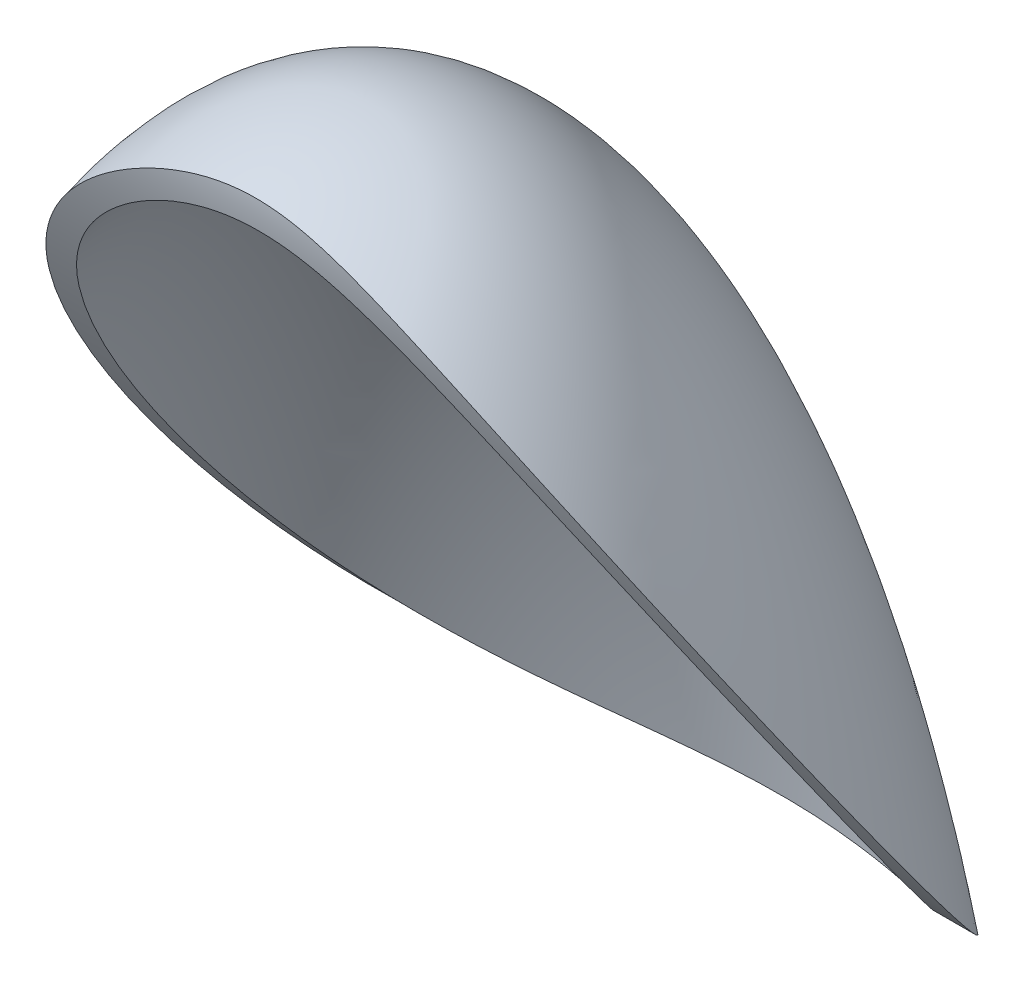
ISO-10303-21;
HEADER;
FILE_DESCRIPTION(('STEP AP214'),'2;1');
FILE_NAME('part.step','',(''),(''),'','','');
FILE_SCHEMA(('AUTOMOTIVE_DESIGN { 1 0 10303 214 1 1 1 1 }'));
ENDSEC;
DATA;
#1=APPLICATION_CONTEXT('core data for automotive mechanical design processes');
#2=APPLICATION_PROTOCOL_DEFINITION('international standard','automotive_design',2000,#1);
#3=PRODUCT_CONTEXT('',#1,'mechanical');
#4=PRODUCT('Part','Part','',(#3));
#5=PRODUCT_RELATED_PRODUCT_CATEGORY('part','',(#4));
#6=PRODUCT_DEFINITION_FORMATION('','',#4);
#7=PRODUCT_DEFINITION_CONTEXT('part definition',#1,'design');
#8=PRODUCT_DEFINITION('design','',#6,#7);
#9=PRODUCT_DEFINITION_SHAPE('','',#8);
#10=(LENGTH_UNIT() NAMED_UNIT(*) SI_UNIT(.MILLI.,.METRE.));
#11=(NAMED_UNIT(*) PLANE_ANGLE_UNIT() SI_UNIT($,.RADIAN.));
#12=(NAMED_UNIT(*) SI_UNIT($,.STERADIAN.) SOLID_ANGLE_UNIT());
#13=UNCERTAINTY_MEASURE_WITH_UNIT(LENGTH_MEASURE(1.E-05),#10,'distance_accuracy_value','');
#14=(GEOMETRIC_REPRESENTATION_CONTEXT(3) GLOBAL_UNCERTAINTY_ASSIGNED_CONTEXT((#13)) GLOBAL_UNIT_ASSIGNED_CONTEXT((#10,
#11,#12)) REPRESENTATION_CONTEXT('',''));
#15=CARTESIAN_POINT('',(0.,0.,0.));
#16=DIRECTION('',(0.,0.,1.));
#17=DIRECTION('',(1.,0.,0.));
#18=AXIS2_PLACEMENT_3D('',#15,#16,#17);
#19=CARTESIAN_POINT('',(0.,302.532717089329,0.));
#20=CARTESIAN_POINT('',(-28.8521869461278,302.532717089329,0.));
#21=CARTESIAN_POINT('',(-50.,239.632111848405,0.));
#22=CARTESIAN_POINT('',(-50.,154.378259766416,0.));
#23=B_SPLINE_CURVE_WITH_KNOTS('',3,(#19,#20,#21,#22),.UNSPECIFIED.,.F.,.F.,(4,4),(0.,1.),.UNSPECIFIED.);
#24=CARTESIAN_POINT('',(0.,-138.349059141026,0.));
#25=DIRECTION('',(0.,-1.,0.));
#26=AXIS1_PLACEMENT('',#24,#25);
#27=SURFACE_OF_REVOLUTION('',#23,#26);
#28=CARTESIAN_POINT('',(0.,302.532717089329,0.));
#29=VERTEX_POINT('',#28);
#30=VERTEX_LOOP('',#29);
#31=FACE_BOUND('',#30,.T.);
#32=CARTESIAN_POINT('',(-31.0927344689638,272.676489596926,0.));
#33=CARTESIAN_POINT('',(-31.5845428550672,271.565283000672,-0.630728029564027));
#34=CARTESIAN_POINT('',(-32.0399570409753,270.447477812206,-1.27813054971253));
#35=CARTESIAN_POINT('',(-32.8797230067282,268.202658840393,-2.60314304959778));
#36=CARTESIAN_POINT('',(-33.2640525751386,267.075642293297,-3.28076238921647));
#37=CARTESIAN_POINT('',(-33.962447746007,264.81631542419,-4.66328319077093));
#38=CARTESIAN_POINT('',(-34.2765003453331,263.684004162017,-5.36818967330792));
#39=CARTESIAN_POINT('',(-34.8347644551482,261.416553130935,-6.80343196101892));
#40=CARTESIAN_POINT('',(-35.0789021323208,260.281411639489,-7.53379374210843));
#41=CARTESIAN_POINT('',(-35.4963805452749,258.013038656603,-9.01686911552883));
#42=CARTESIAN_POINT('',(-35.6697349978338,256.879806837526,-9.76957834688676));
#43=CARTESIAN_POINT('',(-35.944506373812,254.618533859265,-11.2953305786975));
#44=CARTESIAN_POINT('',(-36.0459350717279,253.490491880538,-12.0683702294914));
#45=CARTESIAN_POINT('',(-36.1647281064778,251.420908311726,-13.5090484882042));
#46=CARTESIAN_POINT('',(-36.1928565803864,250.478106065138,-14.1740047507303));
#47=CARTESIAN_POINT('',(-36.1951694926074,248.600914086268,-15.5157778607858));
#48=CARTESIAN_POINT('',(-36.1693562116352,247.666523999988,-16.1925942056583));
#49=CARTESIAN_POINT('',(-36.0617195808401,245.808547961446,-17.5569480296547));
#50=CARTESIAN_POINT('',(-35.979885792009,244.884964055466,-18.2444874836126));
#51=CARTESIAN_POINT('',(-35.7578635881197,243.053519374345,-19.6273856206319));
#52=CARTESIAN_POINT('',(-35.6177886022899,242.145631590279,-20.3227265622668));
#53=CARTESIAN_POINT('',(-35.2762650649014,240.347330563715,-21.7207464509499));
#54=CARTESIAN_POINT('',(-35.0748251368491,239.456914884596,-22.4234243535575));
#55=CARTESIAN_POINT('',(-34.6070580564103,237.69788381976,-23.8338567244024));
#56=CARTESIAN_POINT('',(-34.3407570472949,236.829259805775,-24.5416090360453));
#57=CARTESIAN_POINT('',(-33.7437943827319,235.13175900738,-25.9487307499446));
#58=CARTESIAN_POINT('',(-33.4142038193084,234.302473162305,-26.6480582605167));
#59=CARTESIAN_POINT('',(-32.6837152320795,232.675181907204,-28.0460097304883));
#60=CARTESIAN_POINT('',(-32.2828218232122,231.877174476821,-28.7446337324797));
#61=CARTESIAN_POINT('',(-31.4054641364118,230.319974799376,-30.1362056931345));
#62=CARTESIAN_POINT('',(-30.9290715327202,229.560746632624,-30.8291583861631));
#63=CARTESIAN_POINT('',(-29.8958662229987,228.088479546646,-32.2042601541991));
#64=CARTESIAN_POINT('',(-29.3390704099542,227.375430970402,-32.8864114652889));
#65=CARTESIAN_POINT('',(-28.2611248850427,226.1419923322,-34.0976742469952));
#66=CARTESIAN_POINT('',(-27.7551256046514,225.611596380031,-34.6301026244648));
#67=CARTESIAN_POINT('',(-26.6878556663792,224.591399115857,-35.6785236249005));
#68=CARTESIAN_POINT('',(-26.1265911361614,224.101593314389,-36.1945180616406));
#69=CARTESIAN_POINT('',(-25.2436457219213,223.401608278597,-36.9515254901729));
#70=CARTESIAN_POINT('',(-24.9426320388525,223.174160597488,-37.2009235178374));
#71=CARTESIAN_POINT('',(-24.3269325175998,222.731299631221,-37.6934214364653));
#72=CARTESIAN_POINT('',(-24.0122481253953,222.515885078777,-37.9365219892047));
#73=CARTESIAN_POINT('',(-23.3693715887747,222.097622556288,-38.4156590694076));
#74=CARTESIAN_POINT('',(-23.0411781091207,221.894775833434,-38.6516948945921));
#75=CARTESIAN_POINT('',(-22.3716685314466,221.502172477074,-39.1158355191095));
#76=CARTESIAN_POINT('',(-22.0303533924476,221.312414889746,-39.3439408957424));
#77=CARTESIAN_POINT('',(-21.2165411302006,220.884012200463,-39.8676424719572));
#78=CARTESIAN_POINT('',(-20.7389587995762,220.650729451306,-40.1597639438637));
#79=CARTESIAN_POINT('',(-19.7622894031089,220.208998848665,-40.7263323175351));
#80=CARTESIAN_POINT('',(-19.2632012550599,220.000552246967,-41.0007783281058));
#81=CARTESIAN_POINT('',(-18.2452675842191,219.608669075533,-41.5301196273541));
#82=CARTESIAN_POINT('',(-17.726423208982,219.425231055982,-41.785016048999));
#83=CARTESIAN_POINT('',(-16.6707374756279,219.082947298369,-42.2736967306698));
#84=CARTESIAN_POINT('',(-16.1338893145861,218.924110986652,-42.507472884067));
#85=CARTESIAN_POINT('',(-15.0445089052704,218.630254201235,-42.9523971035209));
#86=CARTESIAN_POINT('',(-14.4919759668698,218.495234777365,-43.1635441719449));
#87=CARTESIAN_POINT('',(-13.3735385529842,218.247713336565,-43.5620513673429));
#88=CARTESIAN_POINT('',(-12.8076348018921,218.135210102883,-43.749412779468));
#89=CARTESIAN_POINT('',(-11.4391698989117,217.890768998932,-44.1685613360046));
#90=CARTESIAN_POINT('',(-10.6312640574987,217.768654865218,-44.388742479813));
#91=CARTESIAN_POINT('',(-8.99932114918395,217.559687968554,-44.7797776500861));
#92=CARTESIAN_POINT('',(-8.17528497229715,217.472833265828,-44.950634389951));
#93=CARTESIAN_POINT('',(-6.51499273519762,217.328969656691,-45.2425889330535));
#94=CARTESIAN_POINT('',(-5.67872422180492,217.271993709973,-45.3636317542932));
#95=CARTESIAN_POINT('',(-3.9990485384129,217.183536573799,-45.5555085175845));
#96=CARTESIAN_POINT('',(-3.15564066707506,217.152057919153,-45.6263374675427));
#97=CARTESIAN_POINT('',(-1.64016859024282,217.115881921115,-45.7083300995027));
#98=CARTESIAN_POINT('',(-0.968684044020592,217.106996766544,-45.728793892444));
#99=CARTESIAN_POINT('',(0.374625030029831,217.102933841484,-45.7381141202217));
#100=CARTESIAN_POINT('',(1.04644958327854,217.107757321134,-45.7269676724094));
#101=CARTESIAN_POINT('',(2.38866235475354,217.131414184854,-45.6730501616388));
#102=CARTESIAN_POINT('',(3.05905039336918,217.150249228776,-45.6302753518947));
#103=CARTESIAN_POINT('',(4.39615671029646,217.203056515855,-45.5131146012634));
#104=CARTESIAN_POINT('',(5.06287657292347,217.237021602371,-45.4387436064141));
#105=CARTESIAN_POINT('',(6.39088815329683,217.321930569059,-45.2584320386822));
#106=CARTESIAN_POINT('',(7.05218046306202,217.372872571535,-45.1524949572373));
#107=CARTESIAN_POINT('',(8.36712654650733,217.494106897888,-44.9091948885408));
#108=CARTESIAN_POINT('',(9.0207812469111,217.564396848187,-44.7718357564501));
#109=CARTESIAN_POINT('',(10.2295161425981,217.715889973092,-44.4868961188454));
#110=CARTESIAN_POINT('',(10.7858799394798,217.794296562482,-44.3432658131915));
#111=CARTESIAN_POINT('',(11.8893233961426,217.969241323415,-44.0332252075882));
#112=CARTESIAN_POINT('',(12.4364036523395,218.065778325335,-43.8668163773074));
#113=CARTESIAN_POINT('',(13.5194127722068,218.278577993537,-43.5118205782963));
#114=CARTESIAN_POINT('',(14.0553420793301,218.394839873707,-43.3232344935067));
#115=CARTESIAN_POINT('',(15.1133126956607,218.648246073527,-42.9250243026073));
#116=CARTESIAN_POINT('',(15.6353743282265,218.785357599159,-42.715433408057));
#117=CARTESIAN_POINT('',(16.6645747571434,219.081604253779,-42.2760370226442));
#118=CARTESIAN_POINT('',(17.1717126775913,219.24074067234,-42.0462303484216));
#119=CARTESIAN_POINT('',(18.1691966878501,219.581636181828,-41.5677182841611));
#120=CARTESIAN_POINT('',(18.6595433818515,219.763394457672,-41.3190135751605));
#121=CARTESIAN_POINT('',(19.5021296722296,220.101658523644,-40.8682306238376));
#122=CARTESIAN_POINT('',(19.8583987749937,220.253209352788,-40.6699311387943));
#123=CARTESIAN_POINT('',(20.5599373746806,220.56910224962,-40.2641902039681));
#124=CARTESIAN_POINT('',(20.9052061334538,220.733445173149,-40.0567481429129));
#125=CARTESIAN_POINT('',(21.584142666186,221.074693173937,-39.6334822408186));
#126=CARTESIAN_POINT('',(21.9178115750413,221.251597017088,-39.4176592241471));
#127=CARTESIAN_POINT('',(22.5731856073738,221.617691909178,-38.9783260598969));
#128=CARTESIAN_POINT('',(22.8948894961329,221.806884220709,-38.7548151235268));
#129=CARTESIAN_POINT('',(23.526322181094,222.197368286242,-38.3006035552323));
#130=CARTESIAN_POINT('',(23.8360370009334,222.398673502019,-38.0698950666083));
#131=CARTESIAN_POINT('',(24.442880987118,222.812723524502,-37.6022487558863));
#132=CARTESIAN_POINT('',(24.7400089984146,223.025469377029,-37.365310365311));
#133=CARTESIAN_POINT('',(25.6122549748755,223.680093959234,-36.6462167119808));
#134=CARTESIAN_POINT('',(26.1683169089858,224.13841063902,-36.15572366416));
#135=CARTESIAN_POINT('',(27.3672333466992,225.218643883434,-35.0280108689569));
#136=CARTESIAN_POINT('',(27.9950058126669,225.852092654309,-34.3858307457426));
#137=CARTESIAN_POINT('',(29.1710621208348,227.172035821303,-33.0835020519477));
#138=CARTESIAN_POINT('',(29.7193257643941,227.858543629023,-32.4233489658801));
#139=CARTESIAN_POINT('',(30.7404100836694,229.276870608193,-31.0912887515918));
#140=CARTESIAN_POINT('',(31.2131251059212,230.008751282888,-30.4193665957397));
#141=CARTESIAN_POINT('',(32.0863885316139,231.509436635708,-29.0700674554518));
#142=CARTESIAN_POINT('',(32.4869326951702,232.278243479809,-28.3926901529781));
#143=CARTESIAN_POINT('',(33.2063772075115,233.816928938722,-27.0620767741662));
#144=CARTESIAN_POINT('',(33.5277737049014,234.585688762422,-26.408886813543));
#145=CARTESIAN_POINT('',(34.1114106248333,236.146909196599,-25.1039178192896));
#146=CARTESIAN_POINT('',(34.3736292896018,236.93937840336,-24.4521393915811));
#147=CARTESIAN_POINT('',(34.8421134344349,238.543789802219,-23.1523759928166));
#148=CARTESIAN_POINT('',(35.048372352457,239.355734265917,-22.5043914753577));
#149=CARTESIAN_POINT('',(35.4081268858974,240.996876029036,-21.2130438458497));
#150=CARTESIAN_POINT('',(35.5615399067283,241.826098206803,-20.5696894930077));
#151=CARTESIAN_POINT('',(35.8177054791949,243.497528464335,-19.2901649893277));
#152=CARTESIAN_POINT('',(35.9204665959321,244.339734323737,-18.6539936416519));
#153=CARTESIAN_POINT('',(36.0775536388249,246.034823022921,-17.3898994819751));
#154=CARTESIAN_POINT('',(36.1318755051685,246.887706751568,-16.7619773657072));
#155=CARTESIAN_POINT('',(36.2035845217438,248.869514736638,-15.3209028129706));
#156=CARTESIAN_POINT('',(36.2041528830775,250.001514298933,-14.5111041171063));
#157=CARTESIAN_POINT('',(36.1282781151682,252.27599550106,-12.9096052829964));
#158=CARTESIAN_POINT('',(36.0518154343598,253.4184797291,-12.1179097917727));
#159=CARTESIAN_POINT('',(35.8241652466458,255.710092502098,-10.5547150840574));
#160=CARTESIAN_POINT('',(35.6729639700977,256.859222232835,-9.78321961675494));
#161=CARTESIAN_POINT('',(35.2972796302991,259.160731822669,-8.26244094082523));
#162=CARTESIAN_POINT('',(35.0727727142626,260.313112618464,-7.51316504886534));
#163=CARTESIAN_POINT('',(34.5512800866017,262.617057683267,-6.03949028678821));
#164=CARTESIAN_POINT('',(34.2543082726044,263.768622066428,-5.31508667691031));
#165=CARTESIAN_POINT('',(33.5879140815986,266.067403058286,-3.8936411586339));
#166=CARTESIAN_POINT('',(33.218506372635,267.214620499364,-3.19659374492954));
#167=CARTESIAN_POINT('',(32.4842790017768,269.281964875906,-1.96331142901414));
#168=CARTESIAN_POINT('',(32.1321367994281,270.203494547847,-1.42185025432753));
#169=CARTESIAN_POINT('',(31.3792615262161,272.03901370057,-0.360381588505209));
#170=CARTESIAN_POINT('',(30.9785312232533,272.953003607701,0.159627122445383));
#171=CARTESIAN_POINT('',(30.1273229616559,274.771061044417,1.1763120660653));
#172=CARTESIAN_POINT('',(29.6768351205315,275.675126563549,1.67298363565474));
#173=CARTESIAN_POINT('',(28.7257228729988,277.468320753139,2.63962172023617));
#174=CARTESIAN_POINT('',(28.2252001593918,278.357475597656,3.1096394766791));
#175=CARTESIAN_POINT('',(27.1716242662944,280.118908473848,4.02133089071146));
#176=CARTESIAN_POINT('',(26.618579016852,280.991189029404,4.46300881033473));
#177=CARTESIAN_POINT('',(25.4580836029524,282.714150068774,5.31488342218405));
#178=CARTESIAN_POINT('',(24.8506582350902,283.564840172702,5.72509430609851));
#179=CARTESIAN_POINT('',(23.6238907767132,285.18003109274,6.48295638303302));
#180=CARTESIAN_POINT('',(23.0084425227936,285.94636804087,6.83298080479348));
#181=CARTESIAN_POINT('',(21.7262814739991,287.450084711589,7.49996824070437));
#182=CARTESIAN_POINT('',(21.0595704898244,288.18746545558,7.81693242167628));
#183=CARTESIAN_POINT('',(19.6731104729879,289.625524617327,8.41429878417255));
#184=CARTESIAN_POINT('',(18.953403959812,290.326231703292,8.69472978740472));
#185=CARTESIAN_POINT('',(17.8325053499308,291.342816715072,9.08557438247682));
#186=CARTESIAN_POINT('',(17.4519890084197,291.675927461479,9.21088718566773));
#187=CARTESIAN_POINT('',(16.6769118071532,292.329248353409,9.4512225947682));
#188=CARTESIAN_POINT('',(16.282351855207,292.649459329959,9.56624586413274));
#189=CARTESIAN_POINT('',(15.2859803776352,293.425769128083,9.83836626791504));
#190=CARTESIAN_POINT('',(14.6756551123243,293.873257116698,9.98913343265474));
#191=CARTESIAN_POINT('',(13.4235698583308,294.730264172277,10.2664846564843));
#192=CARTESIAN_POINT('',(12.781810548533,295.139784058692,10.3930692375591));
#193=CARTESIAN_POINT('',(11.4679023006277,295.913047948976,10.6216230886609));
#194=CARTESIAN_POINT('',(10.7957875136231,296.276841734571,10.7236192410232));
#195=CARTESIAN_POINT('',(9.42191970064548,296.950494279172,10.9035992626167));
#196=CARTESIAN_POINT('',(8.7201744228089,297.260367030883,10.9815893655575));
#197=CARTESIAN_POINT('',(7.44645350852174,297.755748279229,11.1003664750578));
#198=CARTESIAN_POINT('',(6.87969465342652,297.953632021244,11.1455601312663));
#199=CARTESIAN_POINT('',(5.73198870190772,298.306035583787,11.2231903751148));
#200=CARTESIAN_POINT('',(5.15104341087455,298.460560891244,11.2556285771422));
#201=CARTESIAN_POINT('',(3.97858880526175,298.721778771421,11.3088923000218));
#202=CARTESIAN_POINT('',(3.38709378860578,298.828531624162,11.3297324635976));
#203=CARTESIAN_POINT('',(2.4945515814884,298.950453099493,11.3531162497303));
#204=CARTESIAN_POINT('',(2.1961128212393,298.984727709052,11.3595984514934));
#205=CARTESIAN_POINT('',(1.59799019701252,299.040271785934,11.3700312664723));
#206=CARTESIAN_POINT('',(1.29830642112699,299.06154215812,11.3739820558301));
#207=CARTESIAN_POINT('',(0.596827464992078,299.095837479691,11.3803380879029));
#208=CARTESIAN_POINT('',(0.194757845352761,299.103644981472,11.3817694919915));
#209=CARTESIAN_POINT('',(-0.609138885817262,299.095487277878,11.380265139597));
#210=CARTESIAN_POINT('',(-1.01096598466885,299.079520921898,11.3773291717421));
#211=CARTESIAN_POINT('',(-1.81290508525846,299.02407359318,11.367001075215));
#212=CARTESIAN_POINT('',(-2.21301720953031,298.984594329614,11.3596092704405));
#213=CARTESIAN_POINT('',(-3.01058241792561,298.882686934987,11.3401539936784));
#214=CARTESIAN_POINT('',(-3.40803248519328,298.820236174571,11.3280859144369));
#215=CARTESIAN_POINT('',(-4.19867339739974,298.673302356614,11.2989815760689));
#216=CARTESIAN_POINT('',(-4.5918639893063,298.588817997572,11.2819450234527));
#217=CARTESIAN_POINT('',(-5.37289278590536,298.398977629724,11.2425660351464));
#218=CARTESIAN_POINT('',(-5.76073054875134,298.293619908828,11.2202231641878));
#219=CARTESIAN_POINT('',(-6.84545071367345,297.968931597355,11.1492379415672));
#220=CARTESIAN_POINT('',(-7.53523243584311,297.726938178362,11.0940449926687));
#221=CARTESIAN_POINT('',(-8.89012950163617,297.186473262659,10.9630790100659));
#222=CARTESIAN_POINT('',(-9.55523947579668,296.887989556878,10.8873015259456));
#223=CARTESIAN_POINT('',(-10.8594621425396,296.242281359883,10.7139181290336));
#224=CARTESIAN_POINT('',(-11.4985365607313,295.894988229209,10.6162813594));
#225=CARTESIAN_POINT('',(-12.7486152534099,295.159350963804,10.3988564422181));
#226=CARTESIAN_POINT('',(-13.3596177176231,294.771004186967,10.2790668686003));
#227=CARTESIAN_POINT('',(-14.3901586526863,294.070494104058,10.0533278073483));
#228=CARTESIAN_POINT('',(-14.8164253551161,293.766479664613,9.95252923740423));
#229=CARTESIAN_POINT('',(-15.6540469060697,293.1422160638,9.73961870984739));
#230=CARTESIAN_POINT('',(-16.0654002931931,292.821965318724,9.62750564754496));
#231=CARTESIAN_POINT('',(-16.8733923770132,292.167047284266,9.39227886790321));
#232=CARTESIAN_POINT('',(-17.2700268772829,291.832375941389,9.26916204692482));
#233=CARTESIAN_POINT('',(-18.0486937288909,291.150314520413,9.01234736904691));
#234=CARTESIAN_POINT('',(-18.4307244442818,290.80292302586,8.87864833182585));
#235=CARTESIAN_POINT('',(-19.5560810099821,289.743102581593,8.46201425040385));
#236=CARTESIAN_POINT('',(-20.2778834702185,289.013672784466,8.16377344348648));
#237=CARTESIAN_POINT('',(-21.6659806508544,287.519411806447,7.53024826318789));
#238=CARTESIAN_POINT('',(-22.3322780375415,286.754582328792,7.1949656709784));
#239=CARTESIAN_POINT('',(-23.3981304694211,285.456846252771,6.6084158440376));
#240=CARTESIAN_POINT('',(-23.8124698925814,284.93176445644,6.36647307055492));
#241=CARTESIAN_POINT('',(-24.6183032185973,283.870743153643,5.86862109905618));
#242=CARTESIAN_POINT('',(-25.0097957601529,283.334803002753,5.61271107057491));
#243=CARTESIAN_POINT('',(-25.7705760436408,282.253528471382,5.08779838020752));
#244=CARTESIAN_POINT('',(-26.1398602383528,281.708192607974,4.81879363912339));
#245=CARTESIAN_POINT('',(-26.8567395226962,280.609473366987,4.26854486046608));
#246=CARTESIAN_POINT('',(-27.2043327568988,280.056089305948,3.98729977934647));
#247=CARTESIAN_POINT('',(-28.2157494114564,278.384931560147,3.12602232869418));
#248=CARTESIAN_POINT('',(-28.847839152772,277.256682829048,2.52870569904018));
#249=CARTESIAN_POINT('',(-30.0306479022642,274.980164284386,1.29360256989129));
#250=CARTESIAN_POINT('',(-30.5813646359353,273.831893912189,0.655814939879279));
#251=CARTESIAN_POINT('',(-31.0927344689638,272.676489596926,0.));
#252=B_SPLINE_CURVE_WITH_KNOTS('',3,(#32,#33,#34,#35,#36,#37,#38,#39,#40,#41,#42,#43,#44,#45,
#46,#47,#48,#49,#50,#51,#52,#53,#54,#55,#56,#57,#58,#59,#60,#61,#62,#63,#64,#65,#66,#67,#68,#69,
#70,#71,#72,#73,#74,#75,#76,#77,#78,#79,#80,#81,#82,#83,#84,#85,#86,#87,#88,#89,#90,#91,#92,#93,
#94,#95,#96,#97,#98,#99,#100,#101,#102,#103,#104,#105,#106,#107,#108,#109,#110,#111,#112,#113,
#114,#115,#116,#117,#118,#119,#120,#121,#122,#123,#124,#125,#126,#127,#128,#129,#130,#131,#132,
#133,#134,#135,#136,#137,#138,#139,#140,#141,#142,#143,#144,#145,#146,#147,#148,#149,#150,#151,
#152,#153,#154,#155,#156,#157,#158,#159,#160,#161,#162,#163,#164,#165,#166,#167,#168,#169,#170,
#171,#172,#173,#174,#175,#176,#177,#178,#179,#180,#181,#182,#183,#184,#185,#186,#187,#188,#189,
#190,#191,#192,#193,#194,#195,#196,#197,#198,#199,#200,#201,#202,#203,#204,#205,#206,#207,#208,
#209,#210,#211,#212,#213,#214,#215,#216,#217,#218,#219,#220,#221,#222,#223,#224,#225,#226,#227,
#228,#229,#230,#231,#232,#233,#234,#235,#236,#237,#238,#239,#240,#241,#242,#243,#244,#245,#246,
#247,#248,#249,#250,#251),.UNSPECIFIED.,.T.,.F.,(4,2,2,2,2,2,2,2,2,2,2,2,2,2,2,2,2,2,2,2,2,2,2,
2,2,2,2,2,2,2,2,2,2,2,2,2,2,2,2,2,2,2,2,2,2,2,2,2,2,2,2,2,2,2,2,2,2,2,2,2,2,2,2,2,2,2,2,2,2,2,2,
2,2,2,2,2,2,2,2,2,2,2,2,2,2,2,2,2,2,2,2,2,2,2,2,2,2,2,2,2,2,2,2,2,2,2,2,2,2,4),(0.,
4.10674081403701,8.21476267977735,12.3235440128758,16.4366485373509,20.5489556222284,
24.6605893526046,28.1214749745677,31.5822142695255,35.0435986233232,38.4982730085254,
41.9524621382561,45.4052613004915,48.8040894775473,52.2026977520507,55.5980987158965,
58.9927873297181,61.7083963482319,64.4237046056061,65.7801535205705,67.1364593087737,
68.4928994776485,69.8492406963166,71.6675512915111,73.4859534940057,75.3042502339513,
77.1232419547313,78.9423138351741,80.7612873883672,83.2973681545545,85.8333093810111,
88.3720421879045,90.9110273516483,92.9257505722803,94.9406575285014,96.9558032145931,
98.9699967297871,100.983967543233,102.997691395673,104.736724595001,106.475645644885,
108.214497408359,109.950641925937,111.686888138968,113.42307181171,114.727647922507,
116.03231138991,117.336846851442,118.641516561774,119.947664012545,121.2539310655,
123.866126297018,127.158244514096,130.451197610371,133.748716292715,137.046428634169,
140.220619174301,143.395974867128,146.571702752887,149.752371804096,152.932502828004,
156.112900361411,160.285907418025,164.459973909635,168.634809707085,172.811005302607,
176.986400598159,181.160951260593,184.535799279627,187.910455135186,191.285782450324,
194.654383955682,198.022477663193,201.389043312951,204.51707301317,207.644992275956,
210.770428725018,212.333097597874,213.895665639254,216.208816152711,218.521916730793,
220.832476827335,223.142436427947,224.946776073315,226.750887279803,228.552715567407,
229.453877630566,230.354976981779,231.560667122749,232.766415618495,233.972076478132,
235.178928236084,236.385851297665,237.592873395328,239.788675168535,241.984952056675,
244.184349006566,246.38388759026,247.982889695541,249.582048070601,251.181658924539,
252.781448448331,255.984150895046,259.186699405275,261.319990283399,263.45340814123,
265.587165858363,267.721105846072,271.991071012012,276.261155507732),.UNSPECIFIED.);
#253=CARTESIAN_POINT('',(-31.0927344689638,272.676489596926,0.));
#254=VERTEX_POINT('',#253);
#255=EDGE_CURVE('E186',#254,#254,#252,.T.);
#256=ORIENTED_EDGE('',*,*,#255,.T.);
#257=EDGE_LOOP('',(#256));
#258=FACE_BOUND('',#257,.T.);
#259=ADVANCED_FACE('F181',(#31,#258),#27,.F.);
#260=CARTESIAN_POINT('',(-146.799787958494,302.381418318055,11.7185190963716));
#261=CARTESIAN_POINT('',(-146.799787958494,282.851912100813,11.7185190963716));
#262=CARTESIAN_POINT('',(-146.799787958494,216.332213528416,-34.2204950310062));
#263=CARTESIAN_POINT('',(-146.799787958494,216.332213528416,-48.8777416481744));
#264=B_SPLINE_CURVE_WITH_KNOTS('',3,(#260,#261,#262,#263),.UNSPECIFIED.,.F.,.F.,(4,4),(0.,1.),.UNSPECIFIED.);
#265=DIRECTION('',(1.,0.,0.));
#266=VECTOR('',#265,1.);
#267=SURFACE_OF_LINEAR_EXTRUSION('',#264,#266);
#268=ORIENTED_EDGE('',*,*,#255,.F.);
#269=EDGE_LOOP('',(#268));
#270=FACE_BOUND('',#269,.T.);
#271=CARTESIAN_POINT('',(-34.3659675701335,272.676489596926,0.));
#272=CARTESIAN_POINT('',(-34.8777203113279,271.486485852171,-0.675452542212288));
#273=CARTESIAN_POINT('',(-35.3508320868943,270.290220387166,-1.36928465902316));
#274=CARTESIAN_POINT('',(-36.2213292774731,267.889463918,-2.79003835161986));
#275=CARTESIAN_POINT('',(-36.6186941531131,266.68497077429,-3.51696883628072));
#276=CARTESIAN_POINT('',(-37.3384615279348,264.271718682635,-5.00075646038331));
#277=CARTESIAN_POINT('',(-37.6608500517242,263.062958981974,-5.75761914839483));
#278=CARTESIAN_POINT('',(-38.2308349573667,260.6444112135,-7.29883903858152));
#279=CARTESIAN_POINT('',(-38.4783916003881,259.434622940222,-8.08321060324398));
#280=CARTESIAN_POINT('',(-38.89770293534,257.018449649783,-9.67654457488301));
#281=CARTESIAN_POINT('',(-39.0694722746524,255.812064019817,-10.4855021977888));
#282=CARTESIAN_POINT('',(-39.3357813246292,253.406319205935,-12.1258719627567));
#283=CARTESIAN_POINT('',(-39.4303359333663,252.206958710924,-12.9572797412137));
#284=CARTESIAN_POINT('',(-39.5297254345527,250.041358376541,-14.4839046529474));
#285=CARTESIAN_POINT('',(-39.5479845880783,249.0732809051,-15.1756657069089));
#286=CARTESIAN_POINT('',(-39.5301168296409,247.146684725429,-16.5716649053266));
#287=CARTESIAN_POINT('',(-39.4939928462733,246.188165505273,-17.275902375895));
#288=CARTESIAN_POINT('',(-39.3651887796942,244.283163090513,-18.6958422654572));
#289=CARTESIAN_POINT('',(-39.2724978360064,243.336682242826,-19.4115468603613));
#290=CARTESIAN_POINT('',(-39.0281216318853,241.460888713275,-20.8515850081359));
#291=CARTESIAN_POINT('',(-38.8765515171498,240.53154620828,-21.5758990603285));
#292=CARTESIAN_POINT('',(-38.5112335393722,238.691949956095,-23.032884209619));
#293=CARTESIAN_POINT('',(-38.2974946039353,237.781693488208,-23.7655540922936));
#294=CARTESIAN_POINT('',(-37.8041272893846,235.984915012358,-25.2371610373915));
#295=CARTESIAN_POINT('',(-37.5245265705196,235.098383214229,-25.9760953436711));
#296=CARTESIAN_POINT('',(-36.906462635697,233.38582080406,-27.4310893834877));
#297=CARTESIAN_POINT('',(-36.5705142573765,232.558762659352,-28.1470019968313));
#298=CARTESIAN_POINT('',(-35.8288935029721,230.937213583369,-29.5797587070386));
#299=CARTESIAN_POINT('',(-35.4232250719551,230.142720812551,-30.2966027489215));
#300=CARTESIAN_POINT('',(-34.5377436612455,228.594044018872,-31.7268202864419));
#301=CARTESIAN_POINT('',(-34.0579912324566,227.839827748439,-32.440196129922));
#302=CARTESIAN_POINT('',(-33.0192992851314,226.379687984225,-33.8588415355167));
#303=CARTESIAN_POINT('',(-32.4603772951699,225.67375385168,-34.5641128547482));
#304=CARTESIAN_POINT('',(-31.3856689317847,224.462834041618,-35.8126275799401));
#305=CARTESIAN_POINT('',(-30.8855775178278,223.946833357711,-36.3587207714462));
#306=CARTESIAN_POINT('',(-29.8318222611204,222.956665865844,-37.4373031976301));
#307=CARTESIAN_POINT('',(-29.2781642766019,222.482494494098,-37.9697939118906));
#308=CARTESIAN_POINT('',(-28.4077128512413,221.807330514643,-38.7539127104495));
#309=CARTESIAN_POINT('',(-28.1110802713873,221.588404744602,-39.0127075111439));
#310=CARTESIAN_POINT('',(-27.5044410480167,221.163110622538,-39.5248567017371));
#311=CARTESIAN_POINT('',(-27.1944358358421,220.956740932246,-39.778211669563));
#312=CARTESIAN_POINT('',(-26.5611637326394,220.557183019222,-40.2787562921642));
#313=CARTESIAN_POINT('',(-26.2378954811373,220.363996154178,-40.5259453102561));
#314=CARTESIAN_POINT('',(-25.578432938515,219.991426624776,-41.0133149396656));
#315=CARTESIAN_POINT('',(-25.2422396179784,219.81204292692,-41.2534960748537));
#316=CARTESIAN_POINT('',(-24.4401184832427,219.408640707211,-41.806891320908));
#317=CARTESIAN_POINT('',(-23.9691413041546,219.190336420047,-42.1169926065989));
#318=CARTESIAN_POINT('',(-23.0058130521812,218.780312545884,-42.7211901386346));
#319=CARTESIAN_POINT('',(-22.5134609738497,218.588594211234,-43.015285630619));
#320=CARTESIAN_POINT('',(-21.5090934177969,218.232089525736,-43.5855607700025));
#321=CARTESIAN_POINT('',(-20.9970799303791,218.067300457696,-43.861742223249));
#322=CARTESIAN_POINT('',(-19.9551591423491,217.764300262129,-44.3945924733284));
#323=CARTESIAN_POINT('',(-19.4252467453992,217.626096780571,-44.6512556439412));
#324=CARTESIAN_POINT('',(-18.349788261647,217.375342347684,-45.1435611628456));
#325=CARTESIAN_POINT('',(-17.8042408719252,217.262793541287,-45.3792017524817));
#326=CARTESIAN_POINT('',(-16.6997910684076,217.061703023703,-45.8283182011599));
#327=CARTESIAN_POINT('',(-16.1408886627404,216.973161297904,-46.0417940736925));
#328=CARTESIAN_POINT('',(-15.0586336394231,216.824216786457,-46.4290905794117));
#329=CARTESIAN_POINT('',(-14.5361643973921,216.762092272045,-46.6047307421766));
#330=CARTESIAN_POINT('',(-13.4833279553952,216.653941050589,-46.9363845322611));
#331=CARTESIAN_POINT('',(-12.9529596326579,216.607916655221,-47.0923953391164));
#332=CARTESIAN_POINT('',(-11.8856819098339,216.52954411668,-47.3846468535982));
#333=CARTESIAN_POINT('',(-11.348770835019,216.497199554097,-47.520882379077));
#334=CARTESIAN_POINT('',(-10.2697546704154,216.443625410899,-47.7735540340859));
#335=CARTESIAN_POINT('',(-9.72764932733911,216.422396375147,-47.8899891928488));
#336=CARTESIAN_POINT('',(-8.63775322399882,216.388412420201,-48.1034859193788));
#337=CARTESIAN_POINT('',(-8.08995051928057,216.375682308177,-48.2004901992895));
#338=CARTESIAN_POINT('',(-6.99112425054775,216.356301969777,-48.3748911117555));
#339=CARTESIAN_POINT('',(-6.44010060345403,216.34965190093,-48.4522872362458));
#340=CARTESIAN_POINT('',(-5.3357210110483,216.340205949015,-48.5876654589284));
#341=CARTESIAN_POINT('',(-4.78236537728092,216.337409566519,-48.6456500720644));
#342=CARTESIAN_POINT('',(-3.67401134626929,216.333847234954,-48.7424019226184));
#343=CARTESIAN_POINT('',(-3.11901305601121,216.333081156443,-48.7811703850331));
#344=CARTESIAN_POINT('',(-1.98185423092903,216.332256071353,-48.8410118761634));
#345=CARTESIAN_POINT('',(-1.39964518932982,216.332232055583,-48.8611657676456));
#346=CARTESIAN_POINT('',(-0.234870482822439,216.332204636546,-48.8806481561356));
#347=CARTESIAN_POINT('',(0.34769518819466,216.332201233644,-48.879976285823));
#348=CARTESIAN_POINT('',(1.5124781047907,216.332241983118,-48.8578025069113));
#349=CARTESIAN_POINT('',(2.09469531844594,216.332286139334,-48.8362989167758));
#350=CARTESIAN_POINT('',(3.25807291388312,216.333244439744,-48.7723640830138));
#351=CARTESIAN_POINT('',(3.83923311580378,216.334158720235,-48.7299295612365));
#352=CARTESIAN_POINT('',(4.99881700775673,216.338409138032,-48.6240388207777));
#353=CARTESIAN_POINT('',(5.57724337962687,216.341741905143,-48.5606119220907));
#354=CARTESIAN_POINT('',(6.73129564613023,216.352983544565,-48.4125081572038));
#355=CARTESIAN_POINT('',(7.30692172625251,216.360892109499,-48.3278327185782));
#356=CARTESIAN_POINT('',(8.45435135621069,216.383896860085,-48.1370148501392));
#357=CARTESIAN_POINT('',(9.02615569153623,216.398991519629,-48.0308769810476));
#358=CARTESIAN_POINT('',(10.1649141613342,216.439261520904,-47.7969324270193));
#359=CARTESIAN_POINT('',(10.7318688148789,216.464435769648,-47.669128092365));
#360=CARTESIAN_POINT('',(11.866888886704,216.528268882756,-47.3899632274939));
#361=CARTESIAN_POINT('',(12.4348766605181,216.567095237866,-47.2383236784231));
#362=CARTESIAN_POINT('',(13.5630244093699,216.661202523538,-46.9127529860518));
#363=CARTESIAN_POINT('',(14.1231850915481,216.716481957447,-46.7388238711387));
#364=CARTESIAN_POINT('',(15.233932768294,216.846289294697,-46.3689403481955));
#365=CARTESIAN_POINT('',(15.7845201568697,216.920816403849,-46.1729868491125));
#366=CARTESIAN_POINT('',(16.8729012125938,217.091313977408,-45.7600857101109));
#367=CARTESIAN_POINT('',(17.4107220116753,217.187233409074,-45.5431887191474));
#368=CARTESIAN_POINT('',(18.472909037285,217.402487099911,-45.0888453316069));
#369=CARTESIAN_POINT('',(18.99727417788,217.521823242238,-44.8513972831856));
#370=CARTESIAN_POINT('',(20.0304354924167,217.78517134972,-44.3571317952307));
#371=CARTESIAN_POINT('',(20.5392324014069,217.929182147744,-44.1003152721623));
#372=CARTESIAN_POINT('',(21.5419586407825,218.243354507064,-43.5673394045389));
#373=CARTESIAN_POINT('',(22.0357967236669,218.413648376172,-43.2910862742895));
#374=CARTESIAN_POINT('',(23.0041105500727,218.779907530695,-42.7220712035615));
#375=CARTESIAN_POINT('',(23.4785849043042,218.975874653858,-42.4293080821171));
#376=CARTESIAN_POINT('',(24.4066645206825,219.392978067733,-41.8291023700158));
#377=CARTESIAN_POINT('',(24.8602711823963,219.614112667031,-41.521660766651));
#378=CARTESIAN_POINT('',(25.7464094129204,220.081093167658,-40.8933189258384));
#379=CARTESIAN_POINT('',(26.1788988664575,220.326985677448,-40.5723939925102));
#380=CARTESIAN_POINT('',(27.0211554655831,220.841892486991,-39.919448971961));
#381=CARTESIAN_POINT('',(27.4309213403264,221.110908077791,-39.5874282658555));
#382=CARTESIAN_POINT('',(28.2273435810984,221.670610001937,-38.9140222064214));
#383=CARTESIAN_POINT('',(28.6139981055649,221.961298058056,-38.5726361099921));
#384=CARTESIAN_POINT('',(29.3278733858336,222.533726361186,-37.9154574877013));
#385=CARTESIAN_POINT('',(29.6572291757919,222.813624040677,-37.6003734613735));
#386=CARTESIAN_POINT('',(30.2970995662587,223.388631847278,-36.9649609656709));
#387=CARTESIAN_POINT('',(30.6076118607448,223.683743828136,-36.6446318604821));
#388=CARTESIAN_POINT('',(31.5112109515328,224.590158077371,-35.6772493030618));
#389=CARTESIAN_POINT('',(32.0764393115607,225.222602902684,-35.023727002676));
#390=CARTESIAN_POINT('',(33.1357174902897,226.535299288656,-33.7057471825356));
#391=CARTESIAN_POINT('',(33.6296850369315,227.21560477909,-33.0412779946234));
#392=CARTESIAN_POINT('',(34.5496412857588,228.615717329204,-31.7070089607132));
#393=CARTESIAN_POINT('',(34.9756252774302,229.335527121459,-31.0372087487066));
#394=CARTESIAN_POINT('',(35.7548158531485,230.791623301479,-29.7110439034601));
#395=CARTESIAN_POINT('',(36.1094240240404,231.527192864821,-29.0547098594275));
#396=CARTESIAN_POINT('',(36.7611435531091,233.024763715618,-27.7431579209845));
#397=CARTESIAN_POINT('',(37.0582326930302,233.78677508343,-27.0879405544028));
#398=CARTESIAN_POINT('',(37.5981160354945,235.332692915555,-25.7809048129531));
#399=CARTESIAN_POINT('',(37.8409036930714,236.116602006408,-25.1290868570541));
#400=CARTESIAN_POINT('',(38.2754323513436,237.703672851692,-23.8296819274387));
#401=CARTESIAN_POINT('',(38.4671029510209,238.506859514725,-23.1821019748927));
#402=CARTESIAN_POINT('',(38.8015734823563,240.128236110242,-21.8935068686482));
#403=CARTESIAN_POINT('',(38.9443820717803,240.946423357703,-21.2524905714947));
#404=CARTESIAN_POINT('',(39.1834549821732,242.595386595103,-19.9779536189697));
#405=CARTESIAN_POINT('',(39.2797147949445,243.426163796333,-19.3444336954077));
#406=CARTESIAN_POINT('',(39.455518855237,245.413447529616,-17.8484032854501));
#407=CARTESIAN_POINT('',(39.5150582236596,246.574603050936,-16.9896656439705));
#408=CARTESIAN_POINT('',(39.5535969335683,248.911709062353,-15.2902066978604));
#409=CARTESIAN_POINT('',(39.5325721645233,250.087663876491,-14.4494908623462));
#410=CARTESIAN_POINT('',(39.4130000621044,252.450010865113,-12.7881436288702));
#411=CARTESIAN_POINT('',(39.3144407316433,253.636404626743,-11.9675153593638));
#412=CARTESIAN_POINT('',(39.0417074398167,256.018009910468,-10.3468471630482));
#413=CARTESIAN_POINT('',(38.8673830689733,257.213234299433,-9.54685156041944));
#414=CARTESIAN_POINT('',(38.4445190313262,259.606403604614,-7.97138010375238));
#415=CARTESIAN_POINT('',(38.1959920669097,260.804348020396,-7.19590007811636));
#416=CARTESIAN_POINT('',(37.6254110259227,263.199646677657,-5.67166828489678));
#417=CARTESIAN_POINT('',(37.3033608927307,264.397000947336,-4.9229150863228));
#418=CARTESIAN_POINT('',(36.5810100407329,266.802861686669,-3.44538725201418));
#419=CARTESIAN_POINT('',(36.1797653199328,268.011316072206,-2.7169883151197));
#420=CARTESIAN_POINT('',(35.3007995873563,270.420187537359,-1.29341289503734));
#421=CARTESIAN_POINT('',(34.8230712971315,271.620603840706,-0.598239581901864));
#422=CARTESIAN_POINT('',(33.7893809872576,274.009346907428,0.75531626767688));
#423=CARTESIAN_POINT('',(33.2333836271084,275.197667948134,1.41368199588947));
#424=CARTESIAN_POINT('',(32.0432732599395,277.55198727694,2.68634453021784));
#425=CARTESIAN_POINT('',(31.409459272684,278.718052281661,3.30079651215938));
#426=CARTESIAN_POINT('',(30.0596157362565,281.025637729485,4.48270539626638));
#427=CARTESIAN_POINT('',(29.3436168426496,282.167167137124,5.05017968637832));
#428=CARTESIAN_POINT('',(27.825995083165,284.416997025347,6.13133470700397));
#429=CARTESIAN_POINT('',(27.024453742906,285.525327877692,6.64506574842386));
#430=CARTESIAN_POINT('',(25.5491207412003,287.419083547765,7.48700091358925));
#431=CARTESIAN_POINT('',(24.8955436179277,288.214199680723,7.8289249284463));
#432=CARTESIAN_POINT('',(23.5367782915383,289.77518681645,8.47547665028448));
#433=CARTESIAN_POINT('',(22.8315955583866,290.541060905688,8.78010830096787));
#434=CARTESIAN_POINT('',(21.7344466547484,291.66221801825,9.20600203502243));
#435=CARTESIAN_POINT('',(21.3623190106642,292.031191052332,9.34274422336175));
#436=CARTESIAN_POINT('',(20.6046252030599,292.759096105456,9.60548602813549));
#437=CARTESIAN_POINT('',(20.2190586905505,293.118027863303,9.7314853652992));
#438=CARTESIAN_POINT('',(19.4343958721077,293.824614509837,9.97223464073935));
#439=CARTESIAN_POINT('',(19.0353011612444,294.172270718597,10.0869858990774));
#440=CARTESIAN_POINT('',(18.2234320018926,294.854980174791,10.3047938679168));
#441=CARTESIAN_POINT('',(17.8106589586143,295.190034709322,10.4078517749235));
#442=CARTESIAN_POINT('',(16.9450602631452,295.866624664842,10.6079742867852));
#443=CARTESIAN_POINT('',(16.4913444180266,296.207254189934,10.7042605971369));
#444=CARTESIAN_POINT('',(15.5683727436552,296.870626790835,10.8828720991508));
#445=CARTESIAN_POINT('',(15.0991178644218,297.193370956898,10.9651981424339));
#446=CARTESIAN_POINT('',(14.1451133738258,297.818769940342,11.1157730674177));
#447=CARTESIAN_POINT('',(13.6603621880471,298.121422706775,11.1840205134572));
#448=CARTESIAN_POINT('',(12.6759655061188,298.703875572617,11.306544539587));
#449=CARTESIAN_POINT('',(12.1763290575473,298.98368918235,11.3608294206144));
#450=CARTESIAN_POINT('',(11.1623241060484,299.517735395836,11.4560142278749));
#451=CARTESIAN_POINT('',(10.6479564982146,299.771969549627,11.4969149654856));
#452=CARTESIAN_POINT('',(9.60524762449312,300.251567299904,11.566373891925));
#453=CARTESIAN_POINT('',(9.0769100095943,300.476938351375,11.5949352724));
#454=CARTESIAN_POINT('',(7.94035990546979,300.921417723966,11.6442547825594));
#455=CARTESIAN_POINT('',(7.33040014221571,301.136243642968,11.6635964557178));
#456=CARTESIAN_POINT('',(6.09575484950908,301.519525729954,11.6919915918158));
#457=CARTESIAN_POINT('',(5.47107124467014,301.687987922236,11.7010463918652));
#458=CARTESIAN_POINT('',(4.52601973151394,301.901686395284,11.7098417867349));
#459=CARTESIAN_POINT('',(4.20998190805478,301.966375240211,11.7119760315347));
#460=CARTESIAN_POINT('',(3.57544918906278,302.082268338564,11.7151445529431));
#461=CARTESIAN_POINT('',(3.25695455668808,302.133474016132,11.7161789457572));
#462=CARTESIAN_POINT('',(2.61800486617932,302.221873876634,11.7175867408389));
#463=CARTESIAN_POINT('',(2.29754970567677,302.259067321466,11.7179601082904));
#464=CARTESIAN_POINT('',(1.65531961349875,302.319025107976,11.7183986699776));
#465=CARTESIAN_POINT('',(1.33354478149054,302.341790519834,11.7184638870722));
#466=CARTESIAN_POINT('',(0.579928502619138,302.37785358788,11.7185381033517));
#467=CARTESIAN_POINT('',(0.147793707325604,302.385316116872,11.7185205122098));
#468=CARTESIAN_POINT('',(-0.716141759707131,302.373694532587,11.7185173866667));
#469=CARTESIAN_POINT('',(-1.14794239679927,302.354607960914,11.7185318552343));
#470=CARTESIAN_POINT('',(-2.009550242412,302.290298035461,11.7182286459562));
#471=CARTESIAN_POINT('',(-2.43935760993187,302.245076803839,11.7179109950773));
#472=CARTESIAN_POINT('',(-3.29638002459038,302.129306722447,11.7161507701635));
#473=CARTESIAN_POINT('',(-3.7235883777554,302.058708628635,11.7147060025238));
#474=CARTESIAN_POINT('',(-4.57333460993443,301.89349851942,11.7096089210909));
#475=CARTESIAN_POINT('',(-4.9958721702201,301.798884875656,11.7059564575831));
#476=CARTESIAN_POINT('',(-5.83525463218522,301.587174425627,11.6952542344171));
#477=CARTESIAN_POINT('',(-6.25209886023555,301.47007498313,11.6882040762673));
#478=CARTESIAN_POINT('',(-7.18117478151676,301.183599408494,11.6672435729654));
#479=CARTESIAN_POINT('',(-7.69160307818372,301.008451705494,11.652070943831));
#480=CARTESIAN_POINT('',(-8.70115943812646,300.628910786361,11.6126905444896));
#481=CARTESIAN_POINT('',(-9.20028534227229,300.424512036001,11.5884810631349));
#482=CARTESIAN_POINT('',(-10.1863285243229,299.989487248209,11.5295439680226));
#483=CARTESIAN_POINT('',(-10.6732453459264,299.758860232303,11.494815961779));
#484=CARTESIAN_POINT('',(-11.6346976982418,299.273924190582,11.4137947628883));
#485=CARTESIAN_POINT('',(-12.1092211192527,299.019593035701,11.3674906941547));
#486=CARTESIAN_POINT('',(-13.0449697995235,298.489968281571,11.2627480335852));
#487=CARTESIAN_POINT('',(-13.5061960668083,298.214676277105,11.2043103643371));
#488=CARTESIAN_POINT('',(-14.4151687764804,297.645330956348,11.0750423281145));
#489=CARTESIAN_POINT('',(-14.8629138983321,297.351275810871,11.004210751703));
#490=CARTESIAN_POINT('',(-15.7705588352568,296.728681956529,10.8456443075512));
#491=CARTESIAN_POINT('',(-16.2296338997596,296.399132284769,10.7571622513931));
#492=CARTESIAN_POINT('',(-17.1324512026207,295.723305983031,10.5665336732589));
#493=CARTESIAN_POINT('',(-17.5761911449277,295.377026866688,10.4643851161239));
#494=CARTESIAN_POINT('',(-18.4484153426221,294.669562671442,10.2468015616197));
#495=CARTESIAN_POINT('',(-18.8768962495996,294.308374357985,10.1313636713054));
#496=CARTESIAN_POINT('',(-19.7186491854096,293.572790779175,9.8877144284167));
#497=CARTESIAN_POINT('',(-20.1319194285041,293.198393973181,9.75950158256627));
#498=CARTESIAN_POINT('',(-21.3501918359925,292.056702818543,9.35619975344243));
#499=CARTESIAN_POINT('',(-22.1326866748919,291.271701053176,9.06269173718443));
#500=CARTESIAN_POINT('',(-23.6387843391736,289.664426397939,8.43132133089385));
#501=CARTESIAN_POINT('',(-24.3623879329457,288.842153994578,8.09345951972251));
#502=CARTESIAN_POINT('',(-25.7181093488794,287.209491458598,7.39569143848768));
#503=CARTESIAN_POINT('',(-26.3529909691836,286.400557465313,7.0377277358735));
#504=CARTESIAN_POINT('',(-27.5734980689961,284.760550333774,6.28915804294753));
#505=CARTESIAN_POINT('',(-28.1591063739932,283.929469607956,5.89854076483243));
#506=CARTESIAN_POINT('',(-29.2826249644335,282.24954856782,5.08786999250149));
#507=CARTESIAN_POINT('',(-29.8205298972753,281.400706273724,4.66781320444108));
#508=CARTESIAN_POINT('',(-30.8508482860215,279.687765497297,3.80053593363844));
#509=CARTESIAN_POINT('',(-31.3432044896206,278.823649398039,3.35328240498488));
#510=CARTESIAN_POINT('',(-32.2828292234893,277.084131886374,2.43452619318914));
#511=CARTESIAN_POINT('',(-32.7301049698166,276.208732305504,1.96302740930627));
#512=CARTESIAN_POINT('',(-33.5807500683678,274.448880947523,0.997764677688983));
#513=CARTESIAN_POINT('',(-33.9841157260181,273.56442841554,0.503998861352905));
#514=CARTESIAN_POINT('',(-34.3659675701335,272.676489596926,0.));
#515=B_SPLINE_CURVE_WITH_KNOTS('',3,(#271,#272,#273,#274,#275,#276,#277,#278,#279,#280,#281,
#282,#283,#284,#285,#286,#287,#288,#289,#290,#291,#292,#293,#294,#295,#296,#297,#298,#299,#300,
#301,#302,#303,#304,#305,#306,#307,#308,#309,#310,#311,#312,#313,#314,#315,#316,#317,#318,#319,
#320,#321,#322,#323,#324,#325,#326,#327,#328,#329,#330,#331,#332,#333,#334,#335,#336,#337,#338,
#339,#340,#341,#342,#343,#344,#345,#346,#347,#348,#349,#350,#351,#352,#353,#354,#355,#356,#357,
#358,#359,#360,#361,#362,#363,#364,#365,#366,#367,#368,#369,#370,#371,#372,#373,#374,#375,#376,
#377,#378,#379,#380,#381,#382,#383,#384,#385,#386,#387,#388,#389,#390,#391,#392,#393,#394,#395,
#396,#397,#398,#399,#400,#401,#402,#403,#404,#405,#406,#407,#408,#409,#410,#411,#412,#413,#414,
#415,#416,#417,#418,#419,#420,#421,#422,#423,#424,#425,#426,#427,#428,#429,#430,#431,#432,#433,
#434,#435,#436,#437,#438,#439,#440,#441,#442,#443,#444,#445,#446,#447,#448,#449,#450,#451,#452,
#453,#454,#455,#456,#457,#458,#459,#460,#461,#462,#463,#464,#465,#466,#467,#468,#469,#470,#471,
#472,#473,#474,#475,#476,#477,#478,#479,#480,#481,#482,#483,#484,#485,#486,#487,#488,#489,#490,
#491,#492,#493,#494,#495,#496,#497,#498,#499,#500,#501,#502,#503,#504,#505,#506,#507,#508,#509,
#510,#511,#512,#513,#514),.UNSPECIFIED.,.T.,.F.,(4,2,2,2,2,2,2,2,2,2,2,2,2,2,2,2,2,2,2,2,2,2,2,
2,2,2,2,2,2,2,2,2,2,2,2,2,2,2,2,2,2,2,2,2,2,2,2,2,2,2,2,2,2,2,2,2,2,2,2,2,2,2,2,2,2,2,2,2,2,2,2,
2,2,2,2,2,2,2,2,2,2,2,2,2,2,2,2,2,2,2,2,2,2,2,2,2,2,2,2,2,2,2,2,2,2,2,2,2,2,2,2,2,2,2,2,2,2,2,2,
2,2,4),(0.,4.38223917999708,8.76566495383031,13.1499071328599,17.5364734525916,21.9221916106375,
26.3070633732356,29.8757374715339,33.4442193994392,37.013386667536,40.5756088325496,
44.1373197054921,47.6975374103667,51.1280830660774,54.5584346703164,57.985997249598,
61.4128021304938,64.1181035171404,66.8231093760557,68.1740884796543,69.5249233380577,
70.8758971083033,72.226769627133,74.0396043723486,75.8525244834471,77.6652615558817,
79.4785191915422,81.2919283743029,83.1053364533315,84.7687486762588,86.4323996360061,
88.0964857744205,89.7606534756984,91.4296576570906,93.0987050794656,94.7675361773063,
96.4362608763241,98.1835573342624,99.9308846106585,101.678352943063,103.426095046591,
105.171406312987,106.916600352749,108.661423931391,110.406058360249,112.172889916425,
113.939560802013,115.706158803786,117.468586715471,119.231156418629,120.993642773882,
122.765309636631,124.537103388527,126.308778134915,128.083852859923,129.859026758348,
131.634341918408,133.238374135913,134.842602256873,138.050682274455,141.262436942499,
144.474414053361,147.615331380896,150.75745956121,153.899966258882,157.046778884109,
160.193033642542,163.339593051275,167.67317333757,172.008050641183,176.343598821522,
180.687793570784,185.031245084087,189.374463693236,193.77297526957,198.171905672977,
202.5728287158,206.957340977214,211.340223066158,215.718964764655,218.970750908772,
222.222192875868,223.846661118648,225.471171578167,227.095491158163,228.719644381824,
230.445405513946,232.171061331247,233.89689303495,235.621696323906,237.346395031921,
239.070647369129,241.009828380276,242.948757303666,243.916306714714,244.883753888491,
245.851252015899,246.818678371982,248.114424753126,249.410291125906,250.706052287854,
252.004341582218,253.302718929811,254.601248591965,256.219724409553,257.838506844681,
259.457349690155,261.077719244834,262.69796563851,264.31837022926,266.033709498024,
267.749304492961,269.465273663263,271.181443650585,274.617600172464,278.053711853532,
281.318283336118,284.583988031295,287.850058695511,291.120180388789,294.389777797477,
297.659650096219),.UNSPECIFIED.);
#516=CARTESIAN_POINT('',(-34.3659675701335,272.676489596926,0.));
#517=VERTEX_POINT('',#516);
#518=EDGE_CURVE('E13',#517,#517,#515,.T.);
#519=ORIENTED_EDGE('',*,*,#518,.T.);
#520=EDGE_LOOP('',(#519));
#521=FACE_BOUND('',#520,.T.);
#522=ADVANCED_FACE('F203',(#270,#521),#267,.T.);
#523=CARTESIAN_POINT('',(0.,305.532717089329,0.));
#524=CARTESIAN_POINT('',(-2.07577397825462,305.532717089329,0.));
#525=CARTESIAN_POINT('',(-4.12446749178026,305.24811181198,0.));
#526=CARTESIAN_POINT('',(-8.10838948082289,304.145504000282,0.));
#527=CARTESIAN_POINT('',(-10.0429638655633,303.328865976797,0.));
#528=CARTESIAN_POINT('',(-13.7724213997546,301.222136179459,0.));
#529=CARTESIAN_POINT('',(-15.5681036921804,299.932668850478,0.));
#530=CARTESIAN_POINT('',(-19.0249654601523,296.927156915705,0.));
#531=CARTESIAN_POINT('',(-20.6867048501198,295.210915887432,0.));
#532=CARTESIAN_POINT('',(-25.4867199749206,289.465927589424,0.));
#533=CARTESIAN_POINT('',(-28.4425479930059,284.84154379545,0.));
#534=CARTESIAN_POINT('',(-33.8997903095317,274.157206319451,0.));
#535=CARTESIAN_POINT('',(-36.3998808664679,268.095578555274,0.));
#536=CARTESIAN_POINT('',(-40.9248923328253,254.672445262181,0.));
#537=CARTESIAN_POINT('',(-42.9491287028627,247.310870977988,0.));
#538=CARTESIAN_POINT('',(-46.4820388401877,231.43294250815,0.));
#539=CARTESIAN_POINT('',(-47.9904696112287,222.916670487678,0.));
#540=CARTESIAN_POINT('',(-51.6714182823281,195.861551914211,0.));
#541=CARTESIAN_POINT('',(-53.,175.815751276755,0.));
#542=CARTESIAN_POINT('',(-53.,154.378259766416,0.));
#543=B_SPLINE_CURVE_WITH_KNOTS('',3,(#523,#524,#525,#526,#527,#528,#529,#530,#531,#532,#533,
#534,#535,#536,#537,#538,#539,#540,#541,#542),.UNSPECIFIED.,.F.,.F.,(4,2,2,2,2,2,2,2,2,4),(0.,
0.0624999999999996,0.124999999999999,0.187499999999999,0.249999999999998,0.374999999999999,
0.499999999999999,0.624999999999999,0.749999999999999,1.),.UNSPECIFIED.);
#544=CARTESIAN_POINT('',(0.,-138.349059141026,0.));
#545=DIRECTION('',(0.,-1.,0.));
#546=AXIS1_PLACEMENT('',#544,#545);
#547=SURFACE_OF_REVOLUTION('',#543,#546);
#548=CARTESIAN_POINT('',(0.,305.532717089329,0.));
#549=VERTEX_POINT('',#548);
#550=VERTEX_LOOP('',#549);
#551=FACE_BOUND('',#550,.T.);
#552=ORIENTED_EDGE('',*,*,#518,.F.);
#553=EDGE_LOOP('',(#552));
#554=FACE_BOUND('',#553,.T.);
#555=ADVANCED_FACE('F200',(#551,#554),#547,.T.);
#556=CLOSED_SHELL('',(#259,#522,#555));
#557=MANIFOLD_SOLID_BREP('B2',#556);
#558=ADVANCED_BREP_SHAPE_REPRESENTATION('',(#18,#557),#14);
#559=SHAPE_DEFINITION_REPRESENTATION(#9,#558);
ENDSEC;
END-ISO-10303-21;
